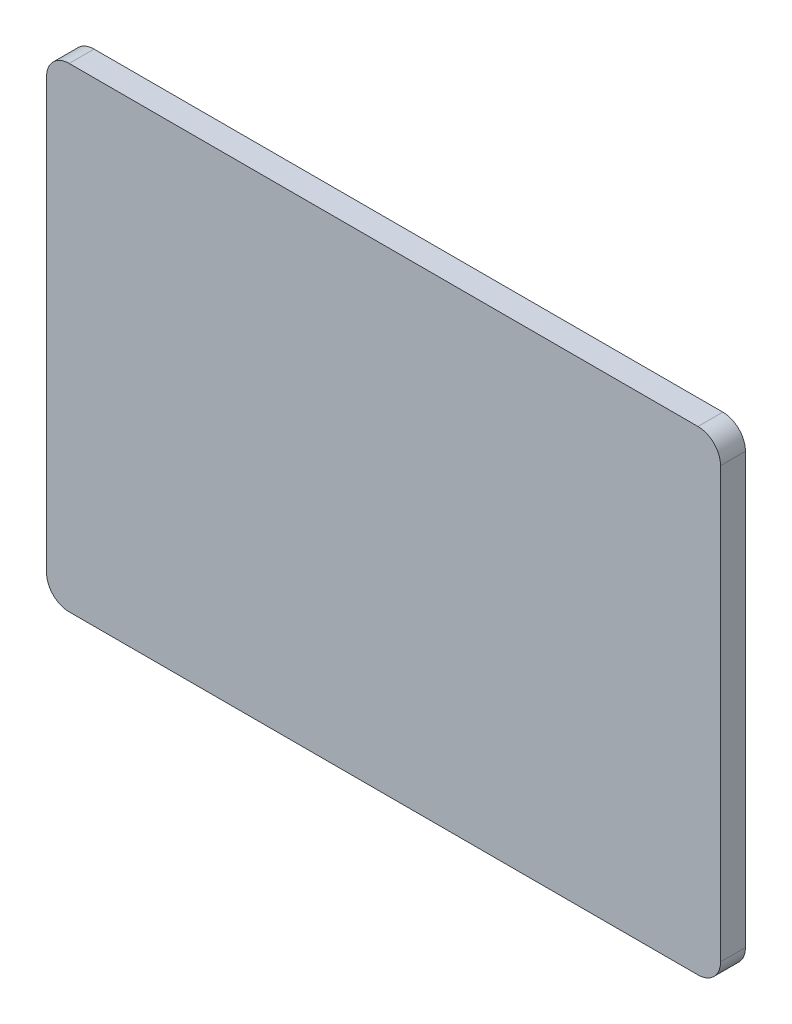
ISO-10303-21;
HEADER;
FILE_DESCRIPTION(('STEP AP214'),'2;1');
FILE_NAME('part.step','',(''),(''),'','','');
FILE_SCHEMA(('AUTOMOTIVE_DESIGN { 1 0 10303 214 1 1 1 1 }'));
ENDSEC;
DATA;
#1=APPLICATION_CONTEXT('core data for automotive mechanical design processes');
#2=APPLICATION_PROTOCOL_DEFINITION('international standard','automotive_design',2000,#1);
#3=PRODUCT_CONTEXT('',#1,'mechanical');
#4=PRODUCT('Part','Part','',(#3));
#5=PRODUCT_RELATED_PRODUCT_CATEGORY('part','',(#4));
#6=PRODUCT_DEFINITION_FORMATION('','',#4);
#7=PRODUCT_DEFINITION_CONTEXT('part definition',#1,'design');
#8=PRODUCT_DEFINITION('design','',#6,#7);
#9=PRODUCT_DEFINITION_SHAPE('','',#8);
#10=(LENGTH_UNIT() NAMED_UNIT(*) SI_UNIT(.MILLI.,.METRE.));
#11=(NAMED_UNIT(*) PLANE_ANGLE_UNIT() SI_UNIT($,.RADIAN.));
#12=(NAMED_UNIT(*) SI_UNIT($,.STERADIAN.) SOLID_ANGLE_UNIT());
#13=UNCERTAINTY_MEASURE_WITH_UNIT(LENGTH_MEASURE(1.E-05),#10,'distance_accuracy_value','');
#14=(GEOMETRIC_REPRESENTATION_CONTEXT(3) GLOBAL_UNCERTAINTY_ASSIGNED_CONTEXT((#13)) GLOBAL_UNIT_ASSIGNED_CONTEXT((#10,
#11,#12)) REPRESENTATION_CONTEXT('',''));
#15=CARTESIAN_POINT('',(0.,0.,0.));
#16=DIRECTION('',(0.,0.,1.));
#17=DIRECTION('',(1.,0.,0.));
#18=AXIS2_PLACEMENT_3D('',#15,#16,#17);
#19=CARTESIAN_POINT('',(0.,0.,11.));
#20=DIRECTION('',(1.,0.,0.));
#21=DIRECTION('',(0.,0.,-1.));
#22=AXIS2_PLACEMENT_3D('',#19,#20,#21);
#23=PLANE('',#22);
#24=DIRECTION('',(0.,-1.,0.));
#25=VECTOR('',#24,1.);
#26=CARTESIAN_POINT('',(0.,0.,0.));
#27=LINE('',#26,#25);
#28=CARTESIAN_POINT('',(0.,200.,0.));
#29=VERTEX_POINT('',#28);
#30=CARTESIAN_POINT('',(0.,10.,0.));
#31=VERTEX_POINT('',#30);
#32=EDGE_CURVE('E128',#29,#31,#27,.T.);
#33=ORIENTED_EDGE('',*,*,#32,.T.);
#34=DIRECTION('',(0.,0.,-1.));
#35=VECTOR('',#34,1.);
#36=CARTESIAN_POINT('',(0.,10.,11.));
#37=LINE('',#36,#35);
#38=CARTESIAN_POINT('',(0.,10.,11.));
#39=VERTEX_POINT('',#38);
#40=EDGE_CURVE('E151',#31,#39,#37,.F.);
#41=ORIENTED_EDGE('',*,*,#40,.T.);
#42=DIRECTION('',(0.,-1.,0.));
#43=VECTOR('',#42,1.);
#44=CARTESIAN_POINT('',(0.,0.,11.));
#45=LINE('',#44,#43);
#46=CARTESIAN_POINT('',(0.,200.,11.));
#47=VERTEX_POINT('',#46);
#48=EDGE_CURVE('E126',#47,#39,#45,.T.);
#49=ORIENTED_EDGE('',*,*,#48,.F.);
#50=DIRECTION('',(0.,0.,-1.));
#51=VECTOR('',#50,1.);
#52=CARTESIAN_POINT('',(0.,200.,11.));
#53=LINE('',#52,#51);
#54=EDGE_CURVE('E148',#47,#29,#53,.T.);
#55=ORIENTED_EDGE('',*,*,#54,.T.);
#56=EDGE_LOOP('',(#33,#41,#49,#55));
#57=FACE_BOUND('',#56,.T.);
#58=ADVANCED_FACE('F33',(#57),#23,.F.);
#59=CARTESIAN_POINT('',(0.,0.,11.));
#60=DIRECTION('',(0.,1.,0.));
#61=DIRECTION('',(0.,0.,1.));
#62=AXIS2_PLACEMENT_3D('',#59,#60,#61);
#63=PLANE('',#62);
#64=DIRECTION('',(1.,0.,0.));
#65=VECTOR('',#64,1.);
#66=CARTESIAN_POINT('',(0.,0.,0.));
#67=LINE('',#66,#65);
#68=CARTESIAN_POINT('',(10.,0.,0.));
#69=VERTEX_POINT('',#68);
#70=CARTESIAN_POINT('',(288.,0.,0.));
#71=VERTEX_POINT('',#70);
#72=EDGE_CURVE('E124',#69,#71,#67,.T.);
#73=ORIENTED_EDGE('',*,*,#72,.T.);
#74=DIRECTION('',(0.,0.,-1.));
#75=VECTOR('',#74,1.);
#76=CARTESIAN_POINT('',(288.,0.,11.));
#77=LINE('',#76,#75);
#78=CARTESIAN_POINT('',(288.,0.,11.));
#79=VERTEX_POINT('',#78);
#80=EDGE_CURVE('E103',#71,#79,#77,.F.);
#81=ORIENTED_EDGE('',*,*,#80,.T.);
#82=DIRECTION('',(1.,0.,0.));
#83=VECTOR('',#82,1.);
#84=CARTESIAN_POINT('',(0.,0.,11.));
#85=LINE('',#84,#83);
#86=CARTESIAN_POINT('',(10.,0.,11.));
#87=VERTEX_POINT('',#86);
#88=EDGE_CURVE('E167',#87,#79,#85,.T.);
#89=ORIENTED_EDGE('',*,*,#88,.F.);
#90=DIRECTION('',(0.,0.,-1.));
#91=VECTOR('',#90,1.);
#92=CARTESIAN_POINT('',(10.,0.,11.));
#93=LINE('',#92,#91);
#94=EDGE_CURVE('E108',#87,#69,#93,.T.);
#95=ORIENTED_EDGE('',*,*,#94,.T.);
#96=EDGE_LOOP('',(#73,#81,#89,#95));
#97=FACE_BOUND('',#96,.T.);
#98=ADVANCED_FACE('F184',(#97),#63,.F.);
#99=CARTESIAN_POINT('',(298.,0.,11.));
#100=DIRECTION('',(-1.,0.,0.));
#101=DIRECTION('',(0.,0.,1.));
#102=AXIS2_PLACEMENT_3D('',#99,#100,#101);
#103=PLANE('',#102);
#104=DIRECTION('',(0.,1.,0.));
#105=VECTOR('',#104,1.);
#106=CARTESIAN_POINT('',(298.,0.,11.));
#107=LINE('',#106,#105);
#108=CARTESIAN_POINT('',(298.,10.,11.));
#109=VERTEX_POINT('',#108);
#110=CARTESIAN_POINT('',(298.,200.,11.));
#111=VERTEX_POINT('',#110);
#112=EDGE_CURVE('E117',#109,#111,#107,.T.);
#113=ORIENTED_EDGE('',*,*,#112,.F.);
#114=DIRECTION('',(0.,0.,-1.));
#115=VECTOR('',#114,1.);
#116=CARTESIAN_POINT('',(298.,10.,11.));
#117=LINE('',#116,#115);
#118=CARTESIAN_POINT('',(298.,10.,0.));
#119=VERTEX_POINT('',#118);
#120=EDGE_CURVE('E102',#109,#119,#117,.T.);
#121=ORIENTED_EDGE('',*,*,#120,.T.);
#122=DIRECTION('',(0.,1.,0.));
#123=VECTOR('',#122,1.);
#124=CARTESIAN_POINT('',(298.,0.,0.));
#125=LINE('',#124,#123);
#126=CARTESIAN_POINT('',(298.,200.,0.));
#127=VERTEX_POINT('',#126);
#128=EDGE_CURVE('E115',#119,#127,#125,.T.);
#129=ORIENTED_EDGE('',*,*,#128,.T.);
#130=DIRECTION('',(0.,0.,-1.));
#131=VECTOR('',#130,1.);
#132=CARTESIAN_POINT('',(298.,200.,11.));
#133=LINE('',#132,#131);
#134=EDGE_CURVE('E119',#127,#111,#133,.F.);
#135=ORIENTED_EDGE('',*,*,#134,.T.);
#136=EDGE_LOOP('',(#113,#121,#129,#135));
#137=FACE_BOUND('',#136,.T.);
#138=ADVANCED_FACE('F114',(#137),#103,.F.);
#139=CARTESIAN_POINT('',(0.,210.,11.));
#140=DIRECTION('',(0.,-1.,0.));
#141=DIRECTION('',(0.,0.,-1.));
#142=AXIS2_PLACEMENT_3D('',#139,#140,#141);
#143=PLANE('',#142);
#144=DIRECTION('',(-1.,0.,0.));
#145=VECTOR('',#144,1.);
#146=CARTESIAN_POINT('',(0.,210.,0.));
#147=LINE('',#146,#145);
#148=CARTESIAN_POINT('',(288.,210.,0.));
#149=VERTEX_POINT('',#148);
#150=CARTESIAN_POINT('',(10.,210.,0.));
#151=VERTEX_POINT('',#150);
#152=EDGE_CURVE('E123',#149,#151,#147,.T.);
#153=ORIENTED_EDGE('',*,*,#152,.T.);
#154=DIRECTION('',(0.,0.,-1.));
#155=VECTOR('',#154,1.);
#156=CARTESIAN_POINT('',(10.,210.,11.));
#157=LINE('',#156,#155);
#158=CARTESIAN_POINT('',(10.,210.,11.));
#159=VERTEX_POINT('',#158);
#160=EDGE_CURVE('E11',#151,#159,#157,.F.);
#161=ORIENTED_EDGE('',*,*,#160,.T.);
#162=DIRECTION('',(-1.,0.,0.));
#163=VECTOR('',#162,1.);
#164=CARTESIAN_POINT('',(0.,210.,11.));
#165=LINE('',#164,#163);
#166=CARTESIAN_POINT('',(288.,210.,11.));
#167=VERTEX_POINT('',#166);
#168=EDGE_CURVE('E132',#167,#159,#165,.T.);
#169=ORIENTED_EDGE('',*,*,#168,.F.);
#170=DIRECTION('',(0.,0.,-1.));
#171=VECTOR('',#170,1.);
#172=CARTESIAN_POINT('',(288.,210.,11.));
#173=LINE('',#172,#171);
#174=EDGE_CURVE('E41',#167,#149,#173,.T.);
#175=ORIENTED_EDGE('',*,*,#174,.T.);
#176=EDGE_LOOP('',(#153,#161,#169,#175));
#177=FACE_BOUND('',#176,.T.);
#178=ADVANCED_FACE('F154',(#177),#143,.F.);
#179=CARTESIAN_POINT('',(0.,0.,11.));
#180=DIRECTION('',(0.,0.,-1.));
#181=DIRECTION('',(-1.,0.,0.));
#182=AXIS2_PLACEMENT_3D('',#179,#180,#181);
#183=PLANE('',#182);
#184=ORIENTED_EDGE('',*,*,#88,.T.);
#185=CARTESIAN_POINT('',(288.,10.,11.));
#186=DIRECTION('',(0.,0.,-1.));
#187=DIRECTION('',(-1.,0.,0.));
#188=AXIS2_PLACEMENT_3D('',#185,#186,#187);
#189=CIRCLE('',#188,10.);
#190=EDGE_CURVE('E146',#79,#109,#189,.F.);
#191=ORIENTED_EDGE('',*,*,#190,.T.);
#192=ORIENTED_EDGE('',*,*,#112,.T.);
#193=CARTESIAN_POINT('',(288.,200.,11.));
#194=DIRECTION('',(0.,0.,-1.));
#195=DIRECTION('',(-1.,0.,0.));
#196=AXIS2_PLACEMENT_3D('',#193,#194,#195);
#197=CIRCLE('',#196,10.);
#198=EDGE_CURVE('E53',#111,#167,#197,.F.);
#199=ORIENTED_EDGE('',*,*,#198,.T.);
#200=ORIENTED_EDGE('',*,*,#168,.T.);
#201=CARTESIAN_POINT('',(10.,200.,11.));
#202=DIRECTION('',(0.,0.,-1.));
#203=DIRECTION('',(-1.,0.,0.));
#204=AXIS2_PLACEMENT_3D('',#201,#202,#203);
#205=CIRCLE('',#204,10.);
#206=EDGE_CURVE('E142',#159,#47,#205,.F.);
#207=ORIENTED_EDGE('',*,*,#206,.T.);
#208=ORIENTED_EDGE('',*,*,#48,.T.);
#209=CARTESIAN_POINT('',(10.,10.,11.));
#210=DIRECTION('',(0.,0.,-1.));
#211=DIRECTION('',(-1.,0.,0.));
#212=AXIS2_PLACEMENT_3D('',#209,#210,#211);
#213=CIRCLE('',#212,10.);
#214=EDGE_CURVE('E144',#39,#87,#213,.F.);
#215=ORIENTED_EDGE('',*,*,#214,.T.);
#216=EDGE_LOOP('',(#184,#191,#192,#199,#200,#207,#208,#215));
#217=FACE_BOUND('',#216,.T.);
#218=ADVANCED_FACE('F173',(#217),#183,.F.);
#219=CARTESIAN_POINT('',(0.,0.,0.));
#220=DIRECTION('',(0.,0.,-1.));
#221=DIRECTION('',(-1.,0.,0.));
#222=AXIS2_PLACEMENT_3D('',#219,#220,#221);
#223=PLANE('',#222);
#224=ORIENTED_EDGE('',*,*,#128,.F.);
#225=CARTESIAN_POINT('',(288.,10.,0.));
#226=DIRECTION('',(0.,0.,-1.));
#227=DIRECTION('',(-1.,0.,0.));
#228=AXIS2_PLACEMENT_3D('',#225,#226,#227);
#229=CIRCLE('',#228,10.);
#230=EDGE_CURVE('E98',#119,#71,#229,.T.);
#231=ORIENTED_EDGE('',*,*,#230,.T.);
#232=ORIENTED_EDGE('',*,*,#72,.F.);
#233=CARTESIAN_POINT('',(10.,10.,0.));
#234=DIRECTION('',(0.,0.,-1.));
#235=DIRECTION('',(-1.,0.,0.));
#236=AXIS2_PLACEMENT_3D('',#233,#234,#235);
#237=CIRCLE('',#236,10.);
#238=EDGE_CURVE('E109',#69,#31,#237,.T.);
#239=ORIENTED_EDGE('',*,*,#238,.T.);
#240=ORIENTED_EDGE('',*,*,#32,.F.);
#241=CARTESIAN_POINT('',(10.,200.,0.));
#242=DIRECTION('',(0.,0.,-1.));
#243=DIRECTION('',(-1.,0.,0.));
#244=AXIS2_PLACEMENT_3D('',#241,#242,#243);
#245=CIRCLE('',#244,10.);
#246=EDGE_CURVE('E135',#29,#151,#245,.T.);
#247=ORIENTED_EDGE('',*,*,#246,.T.);
#248=ORIENTED_EDGE('',*,*,#152,.F.);
#249=CARTESIAN_POINT('',(288.,200.,0.));
#250=DIRECTION('',(0.,0.,-1.));
#251=DIRECTION('',(-1.,0.,0.));
#252=AXIS2_PLACEMENT_3D('',#249,#250,#251);
#253=CIRCLE('',#252,10.);
#254=EDGE_CURVE('E118',#149,#127,#253,.T.);
#255=ORIENTED_EDGE('',*,*,#254,.T.);
#256=EDGE_LOOP('',(#224,#231,#232,#239,#240,#247,#248,#255));
#257=FACE_BOUND('',#256,.T.);
#258=ADVANCED_FACE('F121',(#257),#223,.T.);
#259=CARTESIAN_POINT('',(288.,10.,11.));
#260=DIRECTION('',(0.,0.,-1.));
#261=DIRECTION('',(-1.,0.,0.));
#262=AXIS2_PLACEMENT_3D('',#259,#260,#261);
#263=CYLINDRICAL_SURFACE('',#262,10.);
#264=ORIENTED_EDGE('',*,*,#190,.F.);
#265=ORIENTED_EDGE('',*,*,#80,.F.);
#266=ORIENTED_EDGE('',*,*,#230,.F.);
#267=ORIENTED_EDGE('',*,*,#120,.F.);
#268=EDGE_LOOP('',(#264,#265,#266,#267));
#269=FACE_BOUND('',#268,.T.);
#270=ADVANCED_FACE('F101',(#269),#263,.T.);
#271=CARTESIAN_POINT('',(10.,10.,11.));
#272=DIRECTION('',(0.,0.,-1.));
#273=DIRECTION('',(-1.,0.,0.));
#274=AXIS2_PLACEMENT_3D('',#271,#272,#273);
#275=CYLINDRICAL_SURFACE('',#274,10.);
#276=ORIENTED_EDGE('',*,*,#214,.F.);
#277=ORIENTED_EDGE('',*,*,#40,.F.);
#278=ORIENTED_EDGE('',*,*,#238,.F.);
#279=ORIENTED_EDGE('',*,*,#94,.F.);
#280=EDGE_LOOP('',(#276,#277,#278,#279));
#281=FACE_BOUND('',#280,.T.);
#282=ADVANCED_FACE('F195',(#281),#275,.T.);
#283=CARTESIAN_POINT('',(10.,200.,11.));
#284=DIRECTION('',(0.,0.,-1.));
#285=DIRECTION('',(-1.,0.,0.));
#286=AXIS2_PLACEMENT_3D('',#283,#284,#285);
#287=CYLINDRICAL_SURFACE('',#286,10.);
#288=ORIENTED_EDGE('',*,*,#206,.F.);
#289=ORIENTED_EDGE('',*,*,#160,.F.);
#290=ORIENTED_EDGE('',*,*,#246,.F.);
#291=ORIENTED_EDGE('',*,*,#54,.F.);
#292=EDGE_LOOP('',(#288,#289,#290,#291));
#293=FACE_BOUND('',#292,.T.);
#294=ADVANCED_FACE('F161',(#293),#287,.T.);
#295=CARTESIAN_POINT('',(288.,200.,11.));
#296=DIRECTION('',(0.,0.,-1.));
#297=DIRECTION('',(-1.,0.,0.));
#298=AXIS2_PLACEMENT_3D('',#295,#296,#297);
#299=CYLINDRICAL_SURFACE('',#298,10.);
#300=ORIENTED_EDGE('',*,*,#198,.F.);
#301=ORIENTED_EDGE('',*,*,#134,.F.);
#302=ORIENTED_EDGE('',*,*,#254,.F.);
#303=ORIENTED_EDGE('',*,*,#174,.F.);
#304=EDGE_LOOP('',(#300,#301,#302,#303));
#305=FACE_BOUND('',#304,.T.);
#306=ADVANCED_FACE('F35',(#305),#299,.T.);
#307=CLOSED_SHELL('',(#58,#98,#138,#178,#218,#258,#270,#282,#294,#306));
#308=MANIFOLD_SOLID_BREP('B2',#307);
#309=ADVANCED_BREP_SHAPE_REPRESENTATION('',(#18,#308),#14);
#310=SHAPE_DEFINITION_REPRESENTATION(#9,#309);
ENDSEC;
END-ISO-10303-21;
